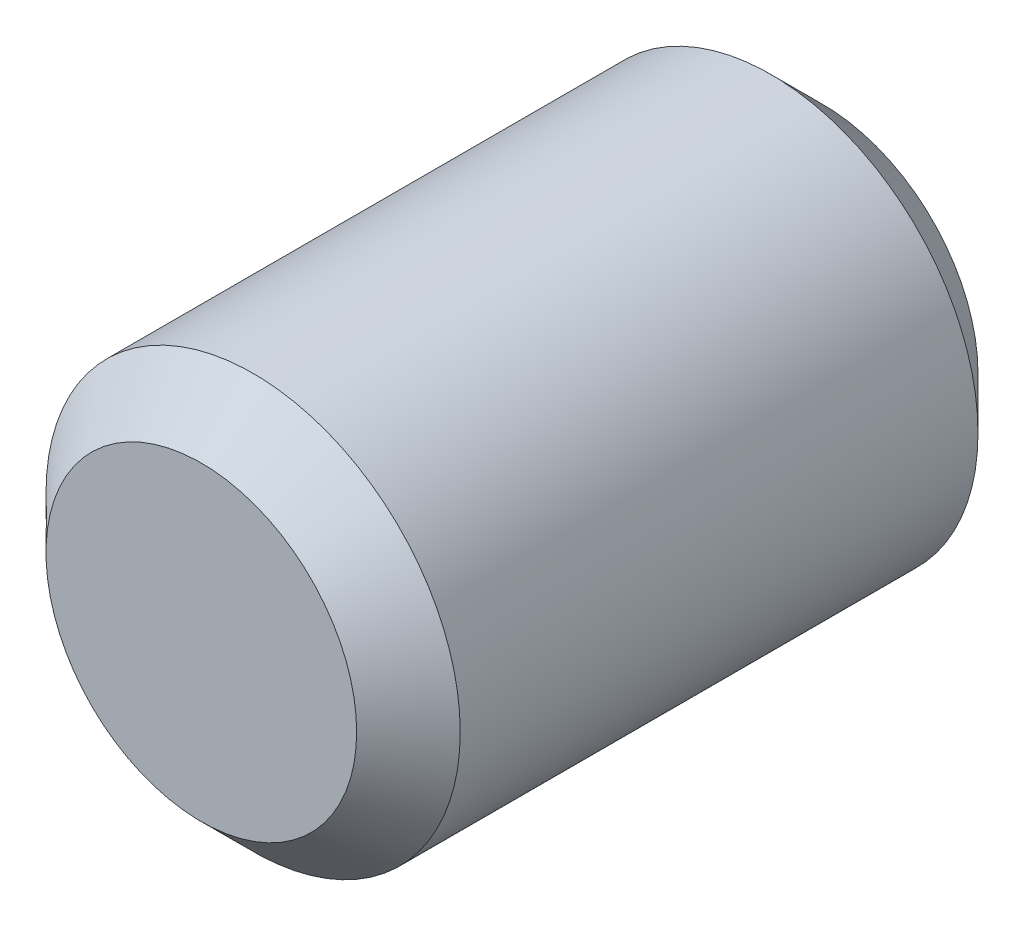
ISO-10303-21;
HEADER;
FILE_DESCRIPTION(('STEP AP214'),'2;1');
FILE_NAME('part.step','',(''),(''),'','','');
FILE_SCHEMA(('AUTOMOTIVE_DESIGN { 1 0 10303 214 1 1 1 1 }'));
ENDSEC;
DATA;
#1=APPLICATION_CONTEXT('core data for automotive mechanical design processes');
#2=APPLICATION_PROTOCOL_DEFINITION('international standard','automotive_design',2000,#1);
#3=PRODUCT_CONTEXT('',#1,'mechanical');
#4=PRODUCT('Part','Part','',(#3));
#5=PRODUCT_RELATED_PRODUCT_CATEGORY('part','',(#4));
#6=PRODUCT_DEFINITION_FORMATION('','',#4);
#7=PRODUCT_DEFINITION_CONTEXT('part definition',#1,'design');
#8=PRODUCT_DEFINITION('design','',#6,#7);
#9=PRODUCT_DEFINITION_SHAPE('','',#8);
#10=(LENGTH_UNIT() NAMED_UNIT(*) SI_UNIT(.MILLI.,.METRE.));
#11=(NAMED_UNIT(*) PLANE_ANGLE_UNIT() SI_UNIT($,.RADIAN.));
#12=(NAMED_UNIT(*) SI_UNIT($,.STERADIAN.) SOLID_ANGLE_UNIT());
#13=UNCERTAINTY_MEASURE_WITH_UNIT(LENGTH_MEASURE(1.E-05),#10,'distance_accuracy_value','');
#14=(GEOMETRIC_REPRESENTATION_CONTEXT(3) GLOBAL_UNCERTAINTY_ASSIGNED_CONTEXT((#13)) GLOBAL_UNIT_ASSIGNED_CONTEXT((#10,
#11,#12)) REPRESENTATION_CONTEXT('',''));
#15=CARTESIAN_POINT('',(0.,0.,0.));
#16=DIRECTION('',(0.,0.,1.));
#17=DIRECTION('',(1.,0.,0.));
#18=AXIS2_PLACEMENT_3D('',#15,#16,#17);
#19=CARTESIAN_POINT('',(0.,0.,6.));
#20=DIRECTION('',(0.,0.,-1.));
#21=DIRECTION('',(-1.,0.,0.));
#22=AXIS2_PLACEMENT_3D('',#19,#20,#21);
#23=CYLINDRICAL_SURFACE('',#22,2.);
#24=CARTESIAN_POINT('',(0.,0.,0.5));
#25=DIRECTION('',(0.,0.,1.));
#26=DIRECTION('',(1.,0.,0.));
#27=AXIS2_PLACEMENT_3D('',#24,#25,#26);
#28=CIRCLE('',#27,2.);
#29=CARTESIAN_POINT('',(2.,0.,0.5));
#30=VERTEX_POINT('',#29);
#31=EDGE_CURVE('E45',#30,#30,#28,.T.);
#32=ORIENTED_EDGE('',*,*,#31,.T.);
#33=EDGE_LOOP('',(#32));
#34=FACE_BOUND('',#33,.T.);
#35=CARTESIAN_POINT('',(0.,0.,5.5));
#36=DIRECTION('',(0.,0.,1.));
#37=DIRECTION('',(1.,0.,0.));
#38=AXIS2_PLACEMENT_3D('',#35,#36,#37);
#39=CIRCLE('',#38,2.);
#40=CARTESIAN_POINT('',(2.,0.,5.5));
#41=VERTEX_POINT('',#40);
#42=EDGE_CURVE('E49',#41,#41,#39,.F.);
#43=ORIENTED_EDGE('',*,*,#42,.T.);
#44=EDGE_LOOP('',(#43));
#45=FACE_BOUND('',#44,.T.);
#46=ADVANCED_FACE('F33',(#34,#45),#23,.T.);
#47=CARTESIAN_POINT('',(0.,0.,6.));
#48=DIRECTION('',(0.,0.,1.));
#49=DIRECTION('',(1.,0.,0.));
#50=AXIS2_PLACEMENT_3D('',#47,#48,#49);
#51=PLANE('',#50);
#52=CARTESIAN_POINT('',(0.,0.,6.));
#53=DIRECTION('',(0.,0.,1.));
#54=DIRECTION('',(1.,0.,0.));
#55=AXIS2_PLACEMENT_3D('',#52,#53,#54);
#56=CIRCLE('',#55,1.5);
#57=CARTESIAN_POINT('',(1.5,0.,6.));
#58=VERTEX_POINT('',#57);
#59=EDGE_CURVE('E10',#58,#58,#56,.T.);
#60=ORIENTED_EDGE('',*,*,#59,.T.);
#61=EDGE_LOOP('',(#60));
#62=FACE_BOUND('',#61,.T.);
#63=ADVANCED_FACE('F65',(#62),#51,.T.);
#64=CARTESIAN_POINT('',(0.,0.,0.));
#65=DIRECTION('',(0.,0.,1.));
#66=DIRECTION('',(1.,0.,0.));
#67=AXIS2_PLACEMENT_3D('',#64,#65,#66);
#68=PLANE('',#67);
#69=CARTESIAN_POINT('',(0.,0.,0.));
#70=DIRECTION('',(0.,0.,1.));
#71=DIRECTION('',(1.,0.,0.));
#72=AXIS2_PLACEMENT_3D('',#69,#70,#71);
#73=CIRCLE('',#72,1.5);
#74=CARTESIAN_POINT('',(1.5,0.,0.));
#75=VERTEX_POINT('',#74);
#76=EDGE_CURVE('E41',#75,#75,#73,.F.);
#77=ORIENTED_EDGE('',*,*,#76,.T.);
#78=EDGE_LOOP('',(#77));
#79=FACE_BOUND('',#78,.T.);
#80=ADVANCED_FACE('F62',(#79),#68,.F.);
#81=CARTESIAN_POINT('',(0.,0.,0.5));
#82=DIRECTION('',(0.,0.,1.));
#83=DIRECTION('',(1.,0.,0.));
#84=AXIS2_PLACEMENT_3D('',#81,#82,#83);
#85=CONICAL_SURFACE('',#84,2.,0.78539816339745);
#86=ORIENTED_EDGE('',*,*,#76,.F.);
#87=EDGE_LOOP('',(#86));
#88=FACE_BOUND('',#87,.T.);
#89=ORIENTED_EDGE('',*,*,#31,.F.);
#90=EDGE_LOOP('',(#89));
#91=FACE_BOUND('',#90,.T.);
#92=ADVANCED_FACE('F58',(#88,#91),#85,.T.);
#93=CARTESIAN_POINT('',(0.,0.,6.));
#94=DIRECTION('',(0.,0.,-1.));
#95=DIRECTION('',(-1.,0.,0.));
#96=AXIS2_PLACEMENT_3D('',#93,#94,#95);
#97=CONICAL_SURFACE('',#96,1.5,0.785398163397446);
#98=ORIENTED_EDGE('',*,*,#42,.F.);
#99=EDGE_LOOP('',(#98));
#100=FACE_BOUND('',#99,.T.);
#101=ORIENTED_EDGE('',*,*,#59,.F.);
#102=EDGE_LOOP('',(#101));
#103=FACE_BOUND('',#102,.T.);
#104=ADVANCED_FACE('F36',(#100,#103),#97,.T.);
#105=CLOSED_SHELL('',(#46,#63,#80,#92,#104));
#106=MANIFOLD_SOLID_BREP('B2',#105);
#107=ADVANCED_BREP_SHAPE_REPRESENTATION('',(#18,#106),#14);
#108=SHAPE_DEFINITION_REPRESENTATION(#9,#107);
ENDSEC;
END-ISO-10303-21;
